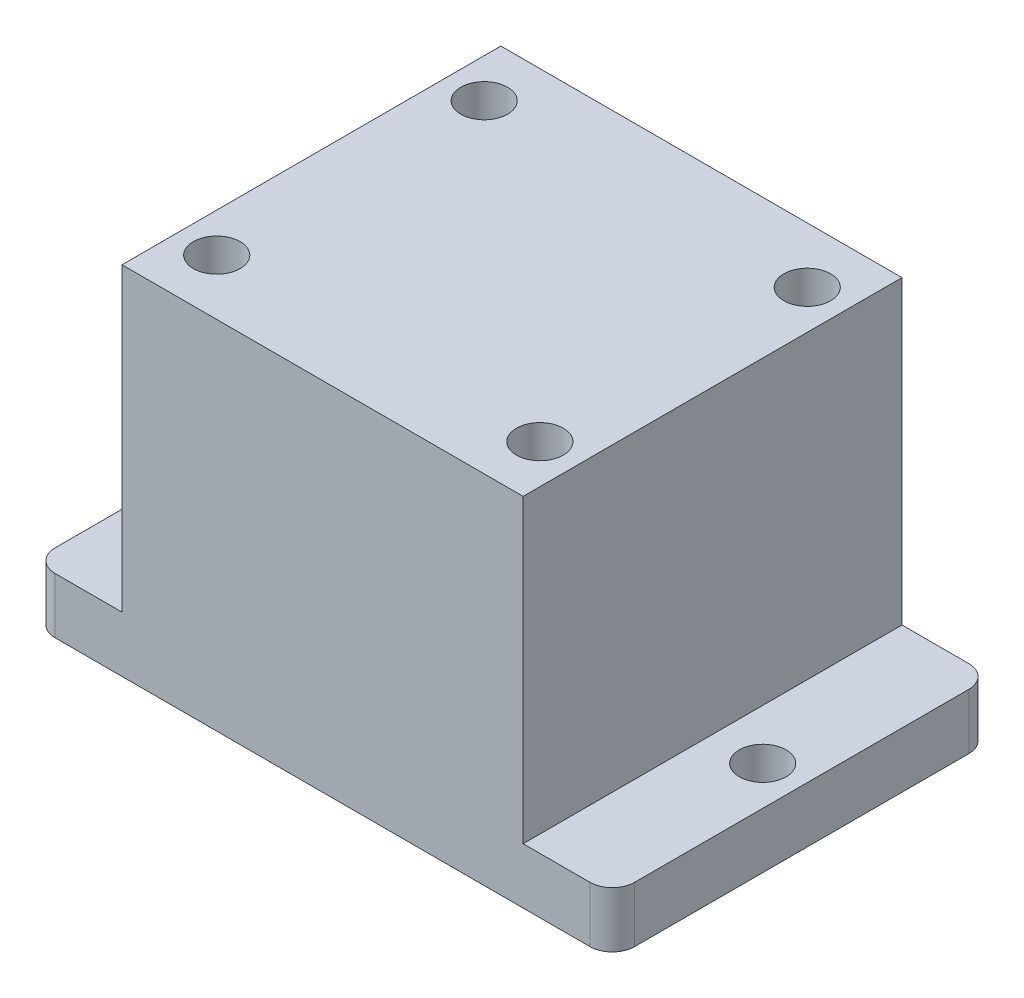
ISO-10303-21;
HEADER;
FILE_DESCRIPTION(('STEP AP214'),'2;1');
FILE_NAME('part.step','',(''),(''),'','','');
FILE_SCHEMA(('AUTOMOTIVE_DESIGN { 1 0 10303 214 1 1 1 1 }'));
ENDSEC;
DATA;
#1=APPLICATION_CONTEXT('core data for automotive mechanical design processes');
#2=APPLICATION_PROTOCOL_DEFINITION('international standard','automotive_design',2000,#1);
#3=PRODUCT_CONTEXT('',#1,'mechanical');
#4=PRODUCT('Part','Part','',(#3));
#5=PRODUCT_RELATED_PRODUCT_CATEGORY('part','',(#4));
#6=PRODUCT_DEFINITION_FORMATION('','',#4);
#7=PRODUCT_DEFINITION_CONTEXT('part definition',#1,'design');
#8=PRODUCT_DEFINITION('design','',#6,#7);
#9=PRODUCT_DEFINITION_SHAPE('','',#8);
#10=(LENGTH_UNIT() NAMED_UNIT(*) SI_UNIT(.MILLI.,.METRE.));
#11=(NAMED_UNIT(*) PLANE_ANGLE_UNIT() SI_UNIT($,.RADIAN.));
#12=(NAMED_UNIT(*) SI_UNIT($,.STERADIAN.) SOLID_ANGLE_UNIT());
#13=UNCERTAINTY_MEASURE_WITH_UNIT(LENGTH_MEASURE(1.E-05),#10,'distance_accuracy_value','');
#14=(GEOMETRIC_REPRESENTATION_CONTEXT(3) GLOBAL_UNCERTAINTY_ASSIGNED_CONTEXT((#13)) GLOBAL_UNIT_ASSIGNED_CONTEXT((#10,
#11,#12)) REPRESENTATION_CONTEXT('',''));
#15=CARTESIAN_POINT('',(0.,0.,0.));
#16=DIRECTION('',(0.,0.,1.));
#17=DIRECTION('',(1.,0.,0.));
#18=AXIS2_PLACEMENT_3D('',#15,#16,#17);
#19=CARTESIAN_POINT('',(0.,5.,0.));
#20=DIRECTION('',(0.,1.,0.));
#21=DIRECTION('',(0.,0.,1.));
#22=AXIS2_PLACEMENT_3D('',#19,#20,#21);
#23=PLANE('',#22);
#24=DIRECTION('',(0.,0.,1.));
#25=VECTOR('',#24,1.);
#26=CARTESIAN_POINT('',(-25.,5.,-17.));
#27=LINE('',#26,#25);
#28=CARTESIAN_POINT('',(-25.,5.,-15.));
#29=VERTEX_POINT('',#28);
#30=CARTESIAN_POINT('',(-25.,5.,15.));
#31=VERTEX_POINT('',#30);
#32=EDGE_CURVE('E182',#29,#31,#27,.T.);
#33=ORIENTED_EDGE('',*,*,#32,.T.);
#34=CARTESIAN_POINT('',(-23.,5.,15.));
#35=DIRECTION('',(0.,1.,0.));
#36=DIRECTION('',(0.,0.,1.));
#37=AXIS2_PLACEMENT_3D('',#34,#35,#36);
#38=CIRCLE('',#37,2.);
#39=CARTESIAN_POINT('',(-23.,5.,17.));
#40=VERTEX_POINT('',#39);
#41=EDGE_CURVE('E233',#31,#40,#38,.T.);
#42=ORIENTED_EDGE('',*,*,#41,.T.);
#43=DIRECTION('',(1.,0.,0.));
#44=VECTOR('',#43,1.);
#45=CARTESIAN_POINT('',(-25.,5.,17.));
#46=LINE('',#45,#44);
#47=CARTESIAN_POINT('',(-17.,5.,17.));
#48=VERTEX_POINT('',#47);
#49=EDGE_CURVE('E188',#40,#48,#46,.T.);
#50=ORIENTED_EDGE('',*,*,#49,.T.);
#51=DIRECTION('',(0.,0.,1.));
#52=VECTOR('',#51,1.);
#53=CARTESIAN_POINT('',(-17.,5.,-17.));
#54=LINE('',#53,#52);
#55=CARTESIAN_POINT('',(-17.,5.,-17.));
#56=VERTEX_POINT('',#55);
#57=EDGE_CURVE('E157',#56,#48,#54,.T.);
#58=ORIENTED_EDGE('',*,*,#57,.F.);
#59=DIRECTION('',(-1.,0.,0.));
#60=VECTOR('',#59,1.);
#61=CARTESIAN_POINT('',(-25.,5.,-17.));
#62=LINE('',#61,#60);
#63=CARTESIAN_POINT('',(-23.,5.,-17.));
#64=VERTEX_POINT('',#63);
#65=EDGE_CURVE('E194',#56,#64,#62,.T.);
#66=ORIENTED_EDGE('',*,*,#65,.T.);
#67=CARTESIAN_POINT('',(-23.,5.,-15.));
#68=DIRECTION('',(0.,1.,0.));
#69=DIRECTION('',(0.,0.,1.));
#70=AXIS2_PLACEMENT_3D('',#67,#68,#69);
#71=CIRCLE('',#70,2.);
#72=EDGE_CURVE('E220',#64,#29,#71,.T.);
#73=ORIENTED_EDGE('',*,*,#72,.T.);
#74=EDGE_LOOP('',(#33,#42,#50,#58,#66,#73));
#75=FACE_BOUND('',#74,.T.);
#76=CARTESIAN_POINT('',(-21.5,5.,0.));
#77=DIRECTION('',(0.,1.,0.));
#78=DIRECTION('',(0.,0.,1.));
#79=AXIS2_PLACEMENT_3D('',#76,#77,#78);
#80=CIRCLE('',#79,2.1);
#81=CARTESIAN_POINT('',(-21.5,5.,2.1));
#82=VERTEX_POINT('',#81);
#83=EDGE_CURVE('E174',#82,#82,#80,.T.);
#84=ORIENTED_EDGE('',*,*,#83,.F.);
#85=EDGE_LOOP('',(#84));
#86=FACE_BOUND('',#85,.T.);
#87=ADVANCED_FACE('F39',(#75,#86),#23,.T.);
#88=DIRECTION('',(0.,0.,-1.));
#89=VECTOR('',#88,1.);
#90=CARTESIAN_POINT('',(27.,5.,-17.));
#91=LINE('',#90,#89);
#92=CARTESIAN_POINT('',(27.,5.,15.));
#93=VERTEX_POINT('',#92);
#94=CARTESIAN_POINT('',(27.,5.,-15.));
#95=VERTEX_POINT('',#94);
#96=EDGE_CURVE('E191',#93,#95,#91,.T.);
#97=ORIENTED_EDGE('',*,*,#96,.T.);
#98=CARTESIAN_POINT('',(25.,5.,-15.));
#99=DIRECTION('',(0.,1.,0.));
#100=DIRECTION('',(0.,0.,1.));
#101=AXIS2_PLACEMENT_3D('',#98,#99,#100);
#102=CIRCLE('',#101,2.);
#103=CARTESIAN_POINT('',(25.,5.,-17.));
#104=VERTEX_POINT('',#103);
#105=EDGE_CURVE('E11',#95,#104,#102,.T.);
#106=ORIENTED_EDGE('',*,*,#105,.T.);
#107=CARTESIAN_POINT('',(19.,5.,-17.));
#108=VERTEX_POINT('',#107);
#109=EDGE_CURVE('E195',#104,#108,#62,.T.);
#110=ORIENTED_EDGE('',*,*,#109,.T.);
#111=DIRECTION('',(0.,0.,-1.));
#112=VECTOR('',#111,1.);
#113=CARTESIAN_POINT('',(19.,5.,-17.));
#114=LINE('',#113,#112);
#115=CARTESIAN_POINT('',(19.,5.,17.));
#116=VERTEX_POINT('',#115);
#117=EDGE_CURVE('E154',#116,#108,#114,.T.);
#118=ORIENTED_EDGE('',*,*,#117,.F.);
#119=CARTESIAN_POINT('',(25.,5.,17.));
#120=VERTEX_POINT('',#119);
#121=EDGE_CURVE('E186',#116,#120,#46,.T.);
#122=ORIENTED_EDGE('',*,*,#121,.T.);
#123=CARTESIAN_POINT('',(25.,5.,15.));
#124=DIRECTION('',(0.,1.,0.));
#125=DIRECTION('',(0.,0.,1.));
#126=AXIS2_PLACEMENT_3D('',#123,#124,#125);
#127=CIRCLE('',#126,2.);
#128=EDGE_CURVE('E246',#120,#93,#127,.T.);
#129=ORIENTED_EDGE('',*,*,#128,.T.);
#130=EDGE_LOOP('',(#97,#106,#110,#118,#122,#129));
#131=FACE_BOUND('',#130,.T.);
#132=CARTESIAN_POINT('',(23.5,5.,0.));
#133=DIRECTION('',(0.,1.,0.));
#134=DIRECTION('',(0.,0.,-1.));
#135=AXIS2_PLACEMENT_3D('',#132,#133,#134);
#136=CIRCLE('',#135,2.1);
#137=CARTESIAN_POINT('',(23.5,5.,-2.10000000000001));
#138=VERTEX_POINT('',#137);
#139=EDGE_CURVE('E164',#138,#138,#136,.T.);
#140=ORIENTED_EDGE('',*,*,#139,.F.);
#141=EDGE_LOOP('',(#140));
#142=FACE_BOUND('',#141,.T.);
#143=ADVANCED_FACE('F261',(#131,#142),#23,.T.);
#144=CARTESIAN_POINT('',(0.,0.,0.));
#145=DIRECTION('',(0.,1.,0.));
#146=DIRECTION('',(0.,0.,1.));
#147=AXIS2_PLACEMENT_3D('',#144,#145,#146);
#148=PLANE('',#147);
#149=DIRECTION('',(-1.,0.,0.));
#150=VECTOR('',#149,1.);
#151=CARTESIAN_POINT('',(-25.,0.,-17.));
#152=LINE('',#151,#150);
#153=CARTESIAN_POINT('',(25.,0.,-17.));
#154=VERTEX_POINT('',#153);
#155=CARTESIAN_POINT('',(-23.,0.,-17.));
#156=VERTEX_POINT('',#155);
#157=EDGE_CURVE('E187',#154,#156,#152,.T.);
#158=ORIENTED_EDGE('',*,*,#157,.F.);
#159=CARTESIAN_POINT('',(25.,0.,-15.));
#160=DIRECTION('',(0.,1.,0.));
#161=DIRECTION('',(0.,0.,1.));
#162=AXIS2_PLACEMENT_3D('',#159,#160,#161);
#163=CIRCLE('',#162,2.);
#164=CARTESIAN_POINT('',(27.,0.,-15.));
#165=VERTEX_POINT('',#164);
#166=EDGE_CURVE('E62',#154,#165,#163,.F.);
#167=ORIENTED_EDGE('',*,*,#166,.T.);
#168=DIRECTION('',(0.,0.,-1.));
#169=VECTOR('',#168,1.);
#170=CARTESIAN_POINT('',(27.,0.,-17.));
#171=LINE('',#170,#169);
#172=CARTESIAN_POINT('',(27.,0.,15.));
#173=VERTEX_POINT('',#172);
#174=EDGE_CURVE('E205',#173,#165,#171,.T.);
#175=ORIENTED_EDGE('',*,*,#174,.F.);
#176=CARTESIAN_POINT('',(25.,0.,15.));
#177=DIRECTION('',(0.,1.,0.));
#178=DIRECTION('',(0.,0.,1.));
#179=AXIS2_PLACEMENT_3D('',#176,#177,#178);
#180=CIRCLE('',#179,2.);
#181=CARTESIAN_POINT('',(25.,0.,17.));
#182=VERTEX_POINT('',#181);
#183=EDGE_CURVE('E240',#173,#182,#180,.F.);
#184=ORIENTED_EDGE('',*,*,#183,.T.);
#185=DIRECTION('',(1.,0.,0.));
#186=VECTOR('',#185,1.);
#187=CARTESIAN_POINT('',(-25.,0.,17.));
#188=LINE('',#187,#186);
#189=CARTESIAN_POINT('',(-23.,0.,17.));
#190=VERTEX_POINT('',#189);
#191=EDGE_CURVE('E202',#190,#182,#188,.T.);
#192=ORIENTED_EDGE('',*,*,#191,.F.);
#193=CARTESIAN_POINT('',(-23.,0.,15.));
#194=DIRECTION('',(0.,1.,0.));
#195=DIRECTION('',(0.,0.,1.));
#196=AXIS2_PLACEMENT_3D('',#193,#194,#195);
#197=CIRCLE('',#196,2.);
#198=CARTESIAN_POINT('',(-25.,0.,15.));
#199=VERTEX_POINT('',#198);
#200=EDGE_CURVE('E227',#190,#199,#197,.F.);
#201=ORIENTED_EDGE('',*,*,#200,.T.);
#202=DIRECTION('',(0.,0.,1.));
#203=VECTOR('',#202,1.);
#204=CARTESIAN_POINT('',(-25.,0.,-17.));
#205=LINE('',#204,#203);
#206=CARTESIAN_POINT('',(-25.,0.,-15.));
#207=VERTEX_POINT('',#206);
#208=EDGE_CURVE('E178',#207,#199,#205,.T.);
#209=ORIENTED_EDGE('',*,*,#208,.F.);
#210=CARTESIAN_POINT('',(-23.,0.,-15.));
#211=DIRECTION('',(0.,1.,0.));
#212=DIRECTION('',(0.,0.,1.));
#213=AXIS2_PLACEMENT_3D('',#210,#211,#212);
#214=CIRCLE('',#213,2.);
#215=EDGE_CURVE('E213',#207,#156,#214,.F.);
#216=ORIENTED_EDGE('',*,*,#215,.T.);
#217=EDGE_LOOP('',(#158,#167,#175,#184,#192,#201,#209,#216));
#218=FACE_BOUND('',#217,.T.);
#219=CARTESIAN_POINT('',(-21.5,0.,0.));
#220=DIRECTION('',(0.,1.,0.));
#221=DIRECTION('',(0.,0.,1.));
#222=AXIS2_PLACEMENT_3D('',#219,#220,#221);
#223=CIRCLE('',#222,2.1);
#224=CARTESIAN_POINT('',(-21.5,0.,2.1));
#225=VERTEX_POINT('',#224);
#226=EDGE_CURVE('E172',#225,#225,#223,.T.);
#227=ORIENTED_EDGE('',*,*,#226,.T.);
#228=EDGE_LOOP('',(#227));
#229=FACE_BOUND('',#228,.T.);
#230=CARTESIAN_POINT('',(23.5,0.,0.));
#231=DIRECTION('',(0.,1.,0.));
#232=DIRECTION('',(0.,0.,-1.));
#233=AXIS2_PLACEMENT_3D('',#230,#231,#232);
#234=CIRCLE('',#233,2.1);
#235=CARTESIAN_POINT('',(23.5,0.,-2.10000000000001));
#236=VERTEX_POINT('',#235);
#237=EDGE_CURVE('E159',#236,#236,#234,.T.);
#238=ORIENTED_EDGE('',*,*,#237,.T.);
#239=EDGE_LOOP('',(#238));
#240=FACE_BOUND('',#239,.T.);
#241=ADVANCED_FACE('F269',(#218,#229,#240),#148,.F.);
#242=CARTESIAN_POINT('',(-25.,5.,-17.));
#243=DIRECTION('',(1.,0.,0.));
#244=DIRECTION('',(0.,0.,-1.));
#245=AXIS2_PLACEMENT_3D('',#242,#243,#244);
#246=PLANE('',#245);
#247=ORIENTED_EDGE('',*,*,#208,.T.);
#248=DIRECTION('',(0.,-1.,0.));
#249=VECTOR('',#248,1.);
#250=CARTESIAN_POINT('',(-25.,5.,15.));
#251=LINE('',#250,#249);
#252=EDGE_CURVE('E230',#199,#31,#251,.F.);
#253=ORIENTED_EDGE('',*,*,#252,.T.);
#254=ORIENTED_EDGE('',*,*,#32,.F.);
#255=DIRECTION('',(0.,-1.,0.));
#256=VECTOR('',#255,1.);
#257=CARTESIAN_POINT('',(-25.,5.,-15.));
#258=LINE('',#257,#256);
#259=EDGE_CURVE('E198',#29,#207,#258,.T.);
#260=ORIENTED_EDGE('',*,*,#259,.T.);
#261=EDGE_LOOP('',(#247,#253,#254,#260));
#262=FACE_BOUND('',#261,.T.);
#263=ADVANCED_FACE('F279',(#262),#246,.F.);
#264=CARTESIAN_POINT('',(-25.,5.,17.));
#265=DIRECTION('',(0.,0.,-1.));
#266=DIRECTION('',(-1.,0.,0.));
#267=AXIS2_PLACEMENT_3D('',#264,#265,#266);
#268=PLANE('',#267);
#269=ORIENTED_EDGE('',*,*,#191,.T.);
#270=DIRECTION('',(0.,-1.,0.));
#271=VECTOR('',#270,1.);
#272=CARTESIAN_POINT('',(25.,5.,17.));
#273=LINE('',#272,#271);
#274=EDGE_CURVE('E243',#182,#120,#273,.F.);
#275=ORIENTED_EDGE('',*,*,#274,.T.);
#276=ORIENTED_EDGE('',*,*,#121,.F.);
#277=DIRECTION('',(0.,-1.,0.));
#278=VECTOR('',#277,1.);
#279=CARTESIAN_POINT('',(19.,32.,17.));
#280=LINE('',#279,#278);
#281=CARTESIAN_POINT('',(19.,32.,17.));
#282=VERTEX_POINT('',#281);
#283=EDGE_CURVE('E139',#282,#116,#280,.T.);
#284=ORIENTED_EDGE('',*,*,#283,.F.);
#285=DIRECTION('',(1.,0.,0.));
#286=VECTOR('',#285,1.);
#287=CARTESIAN_POINT('',(-17.,32.,17.));
#288=LINE('',#287,#286);
#289=CARTESIAN_POINT('',(-17.,32.,17.));
#290=VERTEX_POINT('',#289);
#291=EDGE_CURVE('E129',#290,#282,#288,.T.);
#292=ORIENTED_EDGE('',*,*,#291,.F.);
#293=DIRECTION('',(0.,-1.,0.));
#294=VECTOR('',#293,1.);
#295=CARTESIAN_POINT('',(-17.,32.,17.));
#296=LINE('',#295,#294);
#297=EDGE_CURVE('E135',#290,#48,#296,.T.);
#298=ORIENTED_EDGE('',*,*,#297,.T.);
#299=ORIENTED_EDGE('',*,*,#49,.F.);
#300=DIRECTION('',(0.,-1.,0.));
#301=VECTOR('',#300,1.);
#302=CARTESIAN_POINT('',(-23.,5.,17.));
#303=LINE('',#302,#301);
#304=EDGE_CURVE('E223',#40,#190,#303,.T.);
#305=ORIENTED_EDGE('',*,*,#304,.T.);
#306=EDGE_LOOP('',(#269,#275,#276,#284,#292,#298,#299,#305));
#307=FACE_BOUND('',#306,.T.);
#308=ADVANCED_FACE('F132',(#307),#268,.F.);
#309=CARTESIAN_POINT('',(27.,5.,-17.));
#310=DIRECTION('',(-1.,0.,0.));
#311=DIRECTION('',(0.,0.,1.));
#312=AXIS2_PLACEMENT_3D('',#309,#310,#311);
#313=PLANE('',#312);
#314=ORIENTED_EDGE('',*,*,#174,.T.);
#315=DIRECTION('',(0.,-1.,0.));
#316=VECTOR('',#315,1.);
#317=CARTESIAN_POINT('',(27.,5.,-15.));
#318=LINE('',#317,#316);
#319=EDGE_CURVE('E48',#165,#95,#318,.F.);
#320=ORIENTED_EDGE('',*,*,#319,.T.);
#321=ORIENTED_EDGE('',*,*,#96,.F.);
#322=DIRECTION('',(0.,-1.,0.));
#323=VECTOR('',#322,1.);
#324=CARTESIAN_POINT('',(27.,5.,15.));
#325=LINE('',#324,#323);
#326=EDGE_CURVE('E236',#93,#173,#325,.T.);
#327=ORIENTED_EDGE('',*,*,#326,.T.);
#328=EDGE_LOOP('',(#314,#320,#321,#327));
#329=FACE_BOUND('',#328,.T.);
#330=ADVANCED_FACE('F268',(#329),#313,.F.);
#331=CARTESIAN_POINT('',(-25.,5.,-17.));
#332=DIRECTION('',(0.,0.,1.));
#333=DIRECTION('',(1.,0.,0.));
#334=AXIS2_PLACEMENT_3D('',#331,#332,#333);
#335=PLANE('',#334);
#336=ORIENTED_EDGE('',*,*,#109,.F.);
#337=DIRECTION('',(0.,-1.,0.));
#338=VECTOR('',#337,1.);
#339=CARTESIAN_POINT('',(25.,5.,-17.));
#340=LINE('',#339,#338);
#341=EDGE_CURVE('E249',#104,#154,#340,.T.);
#342=ORIENTED_EDGE('',*,*,#341,.T.);
#343=ORIENTED_EDGE('',*,*,#157,.T.);
#344=DIRECTION('',(0.,-1.,0.));
#345=VECTOR('',#344,1.);
#346=CARTESIAN_POINT('',(-23.,5.,-17.));
#347=LINE('',#346,#345);
#348=EDGE_CURVE('E217',#156,#64,#347,.F.);
#349=ORIENTED_EDGE('',*,*,#348,.T.);
#350=ORIENTED_EDGE('',*,*,#65,.F.);
#351=DIRECTION('',(0.,-1.,0.));
#352=VECTOR('',#351,1.);
#353=CARTESIAN_POINT('',(-17.,32.,-17.));
#354=LINE('',#353,#352);
#355=CARTESIAN_POINT('',(-17.,32.,-17.));
#356=VERTEX_POINT('',#355);
#357=EDGE_CURVE('E300',#356,#56,#354,.T.);
#358=ORIENTED_EDGE('',*,*,#357,.F.);
#359=DIRECTION('',(-1.,0.,0.));
#360=VECTOR('',#359,1.);
#361=CARTESIAN_POINT('',(-17.,32.,-17.));
#362=LINE('',#361,#360);
#363=CARTESIAN_POINT('',(19.,32.,-17.));
#364=VERTEX_POINT('',#363);
#365=EDGE_CURVE('E149',#364,#356,#362,.T.);
#366=ORIENTED_EDGE('',*,*,#365,.F.);
#367=DIRECTION('',(0.,-1.,0.));
#368=VECTOR('',#367,1.);
#369=CARTESIAN_POINT('',(19.,32.,-17.));
#370=LINE('',#369,#368);
#371=EDGE_CURVE('E166',#364,#108,#370,.T.);
#372=ORIENTED_EDGE('',*,*,#371,.T.);
#373=EDGE_LOOP('',(#336,#342,#343,#349,#350,#358,#366,#372));
#374=FACE_BOUND('',#373,.T.);
#375=ADVANCED_FACE('F288',(#374),#335,.F.);
#376=CARTESIAN_POINT('',(-21.5,5.,0.));
#377=DIRECTION('',(0.,-1.,0.));
#378=DIRECTION('',(0.,0.,-1.));
#379=AXIS2_PLACEMENT_3D('',#376,#377,#378);
#380=CYLINDRICAL_SURFACE('',#379,2.1);
#381=ORIENTED_EDGE('',*,*,#83,.T.);
#382=EDGE_LOOP('',(#381));
#383=FACE_BOUND('',#382,.T.);
#384=ORIENTED_EDGE('',*,*,#226,.F.);
#385=EDGE_LOOP('',(#384));
#386=FACE_BOUND('',#385,.T.);
#387=ADVANCED_FACE('F377',(#383,#386),#380,.F.);
#388=CARTESIAN_POINT('',(23.5,5.,0.));
#389=DIRECTION('',(0.,-1.,0.));
#390=DIRECTION('',(0.,0.,-1.));
#391=AXIS2_PLACEMENT_3D('',#388,#389,#390);
#392=CYLINDRICAL_SURFACE('',#391,2.1);
#393=ORIENTED_EDGE('',*,*,#139,.T.);
#394=EDGE_LOOP('',(#393));
#395=FACE_BOUND('',#394,.T.);
#396=ORIENTED_EDGE('',*,*,#237,.F.);
#397=EDGE_LOOP('',(#396));
#398=FACE_BOUND('',#397,.T.);
#399=ADVANCED_FACE('F545',(#395,#398),#392,.F.);
#400=CARTESIAN_POINT('',(-17.,32.,-17.));
#401=DIRECTION('',(1.,0.,0.));
#402=DIRECTION('',(0.,0.,-1.));
#403=AXIS2_PLACEMENT_3D('',#400,#401,#402);
#404=PLANE('',#403);
#405=ORIENTED_EDGE('',*,*,#57,.T.);
#406=ORIENTED_EDGE('',*,*,#297,.F.);
#407=DIRECTION('',(0.,0.,1.));
#408=VECTOR('',#407,1.);
#409=CARTESIAN_POINT('',(-17.,32.,-17.));
#410=LINE('',#409,#408);
#411=EDGE_CURVE('E144',#356,#290,#410,.T.);
#412=ORIENTED_EDGE('',*,*,#411,.F.);
#413=ORIENTED_EDGE('',*,*,#357,.T.);
#414=EDGE_LOOP('',(#405,#406,#412,#413));
#415=FACE_BOUND('',#414,.T.);
#416=ADVANCED_FACE('F156',(#415),#404,.F.);
#417=CARTESIAN_POINT('',(19.,32.,-17.));
#418=DIRECTION('',(-1.,0.,0.));
#419=DIRECTION('',(0.,0.,1.));
#420=AXIS2_PLACEMENT_3D('',#417,#418,#419);
#421=PLANE('',#420);
#422=ORIENTED_EDGE('',*,*,#117,.T.);
#423=ORIENTED_EDGE('',*,*,#371,.F.);
#424=DIRECTION('',(0.,0.,-1.));
#425=VECTOR('',#424,1.);
#426=CARTESIAN_POINT('',(19.,32.,-17.));
#427=LINE('',#426,#425);
#428=EDGE_CURVE('E143',#282,#364,#427,.T.);
#429=ORIENTED_EDGE('',*,*,#428,.F.);
#430=ORIENTED_EDGE('',*,*,#283,.T.);
#431=EDGE_LOOP('',(#422,#423,#429,#430));
#432=FACE_BOUND('',#431,.T.);
#433=ADVANCED_FACE('F296',(#432),#421,.F.);
#434=CARTESIAN_POINT('',(0.,32.,0.));
#435=DIRECTION('',(0.,1.,0.));
#436=DIRECTION('',(0.,0.,1.));
#437=AXIS2_PLACEMENT_3D('',#434,#435,#436);
#438=PLANE('',#437);
#439=CARTESIAN_POINT('',(-13.4999999999998,32.,12.));
#440=DIRECTION('',(0.,1.,0.));
#441=DIRECTION('',(0.,0.,1.));
#442=AXIS2_PLACEMENT_3D('',#439,#440,#441);
#443=CIRCLE('',#442,2.1);
#444=CARTESIAN_POINT('',(-13.4999999999998,32.,14.1));
#445=VERTEX_POINT('',#444);
#446=EDGE_CURVE('E319',#445,#445,#443,.T.);
#447=ORIENTED_EDGE('',*,*,#446,.F.);
#448=EDGE_LOOP('',(#447));
#449=FACE_BOUND('',#448,.T.);
#450=CARTESIAN_POINT('',(15.5000000000002,32.,12.));
#451=DIRECTION('',(0.,1.,0.));
#452=DIRECTION('',(0.,0.,1.));
#453=AXIS2_PLACEMENT_3D('',#450,#451,#452);
#454=CIRCLE('',#453,2.1);
#455=CARTESIAN_POINT('',(15.5000000000002,32.,14.1));
#456=VERTEX_POINT('',#455);
#457=EDGE_CURVE('E327',#456,#456,#454,.T.);
#458=ORIENTED_EDGE('',*,*,#457,.F.);
#459=EDGE_LOOP('',(#458));
#460=FACE_BOUND('',#459,.T.);
#461=CARTESIAN_POINT('',(15.5,32.,-12.));
#462=DIRECTION('',(0.,1.,0.));
#463=DIRECTION('',(0.,0.,1.));
#464=AXIS2_PLACEMENT_3D('',#461,#462,#463);
#465=CIRCLE('',#464,2.1);
#466=CARTESIAN_POINT('',(15.5,32.,-9.90000000000001));
#467=VERTEX_POINT('',#466);
#468=EDGE_CURVE('E335',#467,#467,#465,.T.);
#469=ORIENTED_EDGE('',*,*,#468,.F.);
#470=EDGE_LOOP('',(#469));
#471=FACE_BOUND('',#470,.T.);
#472=CARTESIAN_POINT('',(-13.5,32.,-12.));
#473=DIRECTION('',(0.,1.,0.));
#474=DIRECTION('',(0.,0.,1.));
#475=AXIS2_PLACEMENT_3D('',#472,#473,#474);
#476=CIRCLE('',#475,2.1);
#477=CARTESIAN_POINT('',(-13.5,32.,-9.90000000000001));
#478=VERTEX_POINT('',#477);
#479=EDGE_CURVE('E311',#478,#478,#476,.T.);
#480=ORIENTED_EDGE('',*,*,#479,.F.);
#481=EDGE_LOOP('',(#480));
#482=FACE_BOUND('',#481,.T.);
#483=ORIENTED_EDGE('',*,*,#411,.T.);
#484=ORIENTED_EDGE('',*,*,#291,.T.);
#485=ORIENTED_EDGE('',*,*,#428,.T.);
#486=ORIENTED_EDGE('',*,*,#365,.T.);
#487=EDGE_LOOP('',(#483,#484,#485,#486));
#488=FACE_BOUND('',#487,.T.);
#489=ADVANCED_FACE('F147',(#449,#460,#471,#482,#488),#438,.T.);
#490=CARTESIAN_POINT('',(-13.5,22.,-12.));
#491=DIRECTION('',(0.,1.,0.));
#492=DIRECTION('',(0.,0.,1.));
#493=AXIS2_PLACEMENT_3D('',#490,#491,#492);
#494=CYLINDRICAL_SURFACE('',#493,2.1);
#495=CARTESIAN_POINT('',(-13.5,22.,-12.));
#496=DIRECTION('',(0.,1.,0.));
#497=DIRECTION('',(0.,0.,1.));
#498=AXIS2_PLACEMENT_3D('',#495,#496,#497);
#499=CIRCLE('',#498,2.1);
#500=CARTESIAN_POINT('',(-13.5,22.,-9.90000000000001));
#501=VERTEX_POINT('',#500);
#502=EDGE_CURVE('E306',#501,#501,#499,.T.);
#503=ORIENTED_EDGE('',*,*,#502,.F.);
#504=EDGE_LOOP('',(#503));
#505=FACE_BOUND('',#504,.T.);
#506=ORIENTED_EDGE('',*,*,#479,.T.);
#507=EDGE_LOOP('',(#506));
#508=FACE_BOUND('',#507,.T.);
#509=ADVANCED_FACE('F354',(#505,#508),#494,.F.);
#510=CARTESIAN_POINT('',(-13.5,22.,-12.));
#511=DIRECTION('',(0.,1.,0.));
#512=DIRECTION('',(0.,0.,1.));
#513=AXIS2_PLACEMENT_3D('',#510,#511,#512);
#514=PLANE('',#513);
#515=ORIENTED_EDGE('',*,*,#502,.T.);
#516=EDGE_LOOP('',(#515));
#517=FACE_BOUND('',#516,.T.);
#518=ADVANCED_FACE('F348',(#517),#514,.T.);
#519=CARTESIAN_POINT('',(15.5,22.,-12.));
#520=DIRECTION('',(0.,1.,0.));
#521=DIRECTION('',(0.,0.,1.));
#522=AXIS2_PLACEMENT_3D('',#519,#520,#521);
#523=CYLINDRICAL_SURFACE('',#522,2.1);
#524=CARTESIAN_POINT('',(15.5,22.,-12.));
#525=DIRECTION('',(0.,1.,0.));
#526=DIRECTION('',(0.,0.,1.));
#527=AXIS2_PLACEMENT_3D('',#524,#525,#526);
#528=CIRCLE('',#527,2.1);
#529=CARTESIAN_POINT('',(15.5,22.,-9.90000000000001));
#530=VERTEX_POINT('',#529);
#531=EDGE_CURVE('E315',#530,#530,#528,.T.);
#532=ORIENTED_EDGE('',*,*,#531,.F.);
#533=EDGE_LOOP('',(#532));
#534=FACE_BOUND('',#533,.T.);
#535=ORIENTED_EDGE('',*,*,#468,.T.);
#536=EDGE_LOOP('',(#535));
#537=FACE_BOUND('',#536,.T.);
#538=ADVANCED_FACE('F345',(#534,#537),#523,.F.);
#539=CARTESIAN_POINT('',(15.5,22.,-12.));
#540=DIRECTION('',(0.,1.,0.));
#541=DIRECTION('',(0.,0.,1.));
#542=AXIS2_PLACEMENT_3D('',#539,#540,#541);
#543=PLANE('',#542);
#544=ORIENTED_EDGE('',*,*,#531,.T.);
#545=EDGE_LOOP('',(#544));
#546=FACE_BOUND('',#545,.T.);
#547=ADVANCED_FACE('F343',(#546),#543,.T.);
#548=CARTESIAN_POINT('',(15.5000000000002,22.,12.));
#549=DIRECTION('',(0.,1.,0.));
#550=DIRECTION('',(0.,0.,1.));
#551=AXIS2_PLACEMENT_3D('',#548,#549,#550);
#552=CYLINDRICAL_SURFACE('',#551,2.1);
#553=CARTESIAN_POINT('',(15.5000000000002,22.,12.));
#554=DIRECTION('',(0.,1.,0.));
#555=DIRECTION('',(0.,0.,1.));
#556=AXIS2_PLACEMENT_3D('',#553,#554,#555);
#557=CIRCLE('',#556,2.1);
#558=CARTESIAN_POINT('',(15.5000000000002,22.,14.1));
#559=VERTEX_POINT('',#558);
#560=EDGE_CURVE('E331',#559,#559,#557,.T.);
#561=ORIENTED_EDGE('',*,*,#560,.F.);
#562=EDGE_LOOP('',(#561));
#563=FACE_BOUND('',#562,.T.);
#564=ORIENTED_EDGE('',*,*,#457,.T.);
#565=EDGE_LOOP('',(#564));
#566=FACE_BOUND('',#565,.T.);
#567=ADVANCED_FACE('F489',(#563,#566),#552,.F.);
#568=CARTESIAN_POINT('',(15.5000000000002,22.,12.));
#569=DIRECTION('',(0.,1.,0.));
#570=DIRECTION('',(0.,0.,1.));
#571=AXIS2_PLACEMENT_3D('',#568,#569,#570);
#572=PLANE('',#571);
#573=ORIENTED_EDGE('',*,*,#560,.T.);
#574=EDGE_LOOP('',(#573));
#575=FACE_BOUND('',#574,.T.);
#576=ADVANCED_FACE('F479',(#575),#572,.T.);
#577=CARTESIAN_POINT('',(-13.4999999999998,22.,12.));
#578=DIRECTION('',(0.,1.,0.));
#579=DIRECTION('',(0.,0.,1.));
#580=AXIS2_PLACEMENT_3D('',#577,#578,#579);
#581=CYLINDRICAL_SURFACE('',#580,2.1);
#582=CARTESIAN_POINT('',(-13.4999999999998,22.,12.));
#583=DIRECTION('',(0.,1.,0.));
#584=DIRECTION('',(0.,0.,1.));
#585=AXIS2_PLACEMENT_3D('',#582,#583,#584);
#586=CIRCLE('',#585,2.1);
#587=CARTESIAN_POINT('',(-13.4999999999998,22.,14.1));
#588=VERTEX_POINT('',#587);
#589=EDGE_CURVE('E323',#588,#588,#586,.T.);
#590=ORIENTED_EDGE('',*,*,#589,.F.);
#591=EDGE_LOOP('',(#590));
#592=FACE_BOUND('',#591,.T.);
#593=ORIENTED_EDGE('',*,*,#446,.T.);
#594=EDGE_LOOP('',(#593));
#595=FACE_BOUND('',#594,.T.);
#596=ADVANCED_FACE('F469',(#592,#595),#581,.F.);
#597=CARTESIAN_POINT('',(-13.4999999999998,22.,12.));
#598=DIRECTION('',(0.,1.,0.));
#599=DIRECTION('',(0.,0.,1.));
#600=AXIS2_PLACEMENT_3D('',#597,#598,#599);
#601=PLANE('',#600);
#602=ORIENTED_EDGE('',*,*,#589,.T.);
#603=EDGE_LOOP('',(#602));
#604=FACE_BOUND('',#603,.T.);
#605=ADVANCED_FACE('F391',(#604),#601,.T.);
#606=CARTESIAN_POINT('',(-23.,5.,-15.));
#607=DIRECTION('',(0.,-1.,0.));
#608=DIRECTION('',(0.,0.,-1.));
#609=AXIS2_PLACEMENT_3D('',#606,#607,#608);
#610=CYLINDRICAL_SURFACE('',#609,2.);
#611=ORIENTED_EDGE('',*,*,#72,.F.);
#612=ORIENTED_EDGE('',*,*,#348,.F.);
#613=ORIENTED_EDGE('',*,*,#215,.F.);
#614=ORIENTED_EDGE('',*,*,#259,.F.);
#615=EDGE_LOOP('',(#611,#612,#613,#614));
#616=FACE_BOUND('',#615,.T.);
#617=ADVANCED_FACE('F284',(#616),#610,.T.);
#618=CARTESIAN_POINT('',(-23.,5.,15.));
#619=DIRECTION('',(0.,-1.,0.));
#620=DIRECTION('',(0.,0.,-1.));
#621=AXIS2_PLACEMENT_3D('',#618,#619,#620);
#622=CYLINDRICAL_SURFACE('',#621,2.);
#623=ORIENTED_EDGE('',*,*,#41,.F.);
#624=ORIENTED_EDGE('',*,*,#252,.F.);
#625=ORIENTED_EDGE('',*,*,#200,.F.);
#626=ORIENTED_EDGE('',*,*,#304,.F.);
#627=EDGE_LOOP('',(#623,#624,#625,#626));
#628=FACE_BOUND('',#627,.T.);
#629=ADVANCED_FACE('F275',(#628),#622,.T.);
#630=CARTESIAN_POINT('',(25.,5.,15.));
#631=DIRECTION('',(0.,-1.,0.));
#632=DIRECTION('',(0.,0.,-1.));
#633=AXIS2_PLACEMENT_3D('',#630,#631,#632);
#634=CYLINDRICAL_SURFACE('',#633,2.);
#635=ORIENTED_EDGE('',*,*,#128,.F.);
#636=ORIENTED_EDGE('',*,*,#274,.F.);
#637=ORIENTED_EDGE('',*,*,#183,.F.);
#638=ORIENTED_EDGE('',*,*,#326,.F.);
#639=EDGE_LOOP('',(#635,#636,#637,#638));
#640=FACE_BOUND('',#639,.T.);
#641=ADVANCED_FACE('F267',(#640),#634,.T.);
#642=CARTESIAN_POINT('',(25.,5.,-15.));
#643=DIRECTION('',(0.,-1.,0.));
#644=DIRECTION('',(0.,0.,-1.));
#645=AXIS2_PLACEMENT_3D('',#642,#643,#644);
#646=CYLINDRICAL_SURFACE('',#645,2.);
#647=ORIENTED_EDGE('',*,*,#105,.F.);
#648=ORIENTED_EDGE('',*,*,#319,.F.);
#649=ORIENTED_EDGE('',*,*,#166,.F.);
#650=ORIENTED_EDGE('',*,*,#341,.F.);
#651=EDGE_LOOP('',(#647,#648,#649,#650));
#652=FACE_BOUND('',#651,.T.);
#653=ADVANCED_FACE('F41',(#652),#646,.T.);
#654=CLOSED_SHELL('',(#87,#143,#241,#263,#308,#330,#375,#387,#399,#416,#433,#489,#509,#518,#538,
#547,#567,#576,#596,#605,#617,#629,#641,#653));
#655=MANIFOLD_SOLID_BREP('B2',#654);
#656=ADVANCED_BREP_SHAPE_REPRESENTATION('',(#18,#655),#14);
#657=SHAPE_DEFINITION_REPRESENTATION(#9,#656);
ENDSEC;
END-ISO-10303-21;
